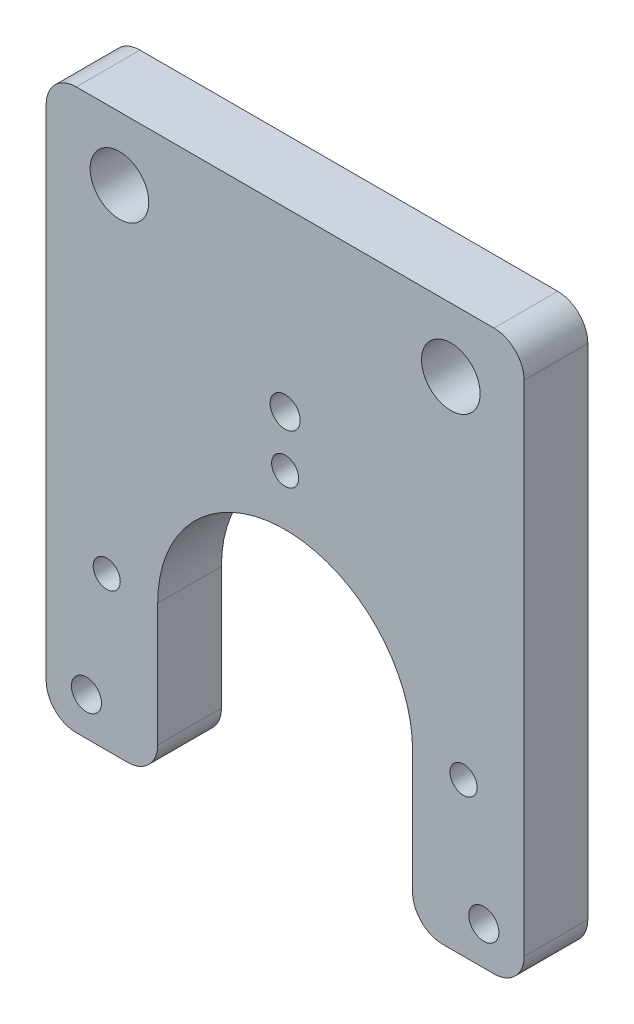
ISO-10303-21;
HEADER;
FILE_DESCRIPTION(('STEP AP214'),'2;1');
FILE_NAME('part.step','',(''),(''),'','','');
FILE_SCHEMA(('AUTOMOTIVE_DESIGN { 1 0 10303 214 1 1 1 1 }'));
ENDSEC;
DATA;
#1=APPLICATION_CONTEXT('core data for automotive mechanical design processes');
#2=APPLICATION_PROTOCOL_DEFINITION('international standard','automotive_design',2000,#1);
#3=PRODUCT_CONTEXT('',#1,'mechanical');
#4=PRODUCT('Part','Part','',(#3));
#5=PRODUCT_RELATED_PRODUCT_CATEGORY('part','',(#4));
#6=PRODUCT_DEFINITION_FORMATION('','',#4);
#7=PRODUCT_DEFINITION_CONTEXT('part definition',#1,'design');
#8=PRODUCT_DEFINITION('design','',#6,#7);
#9=PRODUCT_DEFINITION_SHAPE('','',#8);
#10=(LENGTH_UNIT() NAMED_UNIT(*) SI_UNIT(.MILLI.,.METRE.));
#11=(NAMED_UNIT(*) PLANE_ANGLE_UNIT() SI_UNIT($,.RADIAN.));
#12=(NAMED_UNIT(*) SI_UNIT($,.STERADIAN.) SOLID_ANGLE_UNIT());
#13=UNCERTAINTY_MEASURE_WITH_UNIT(LENGTH_MEASURE(1.E-05),#10,'distance_accuracy_value','');
#14=(GEOMETRIC_REPRESENTATION_CONTEXT(3) GLOBAL_UNCERTAINTY_ASSIGNED_CONTEXT((#13)) GLOBAL_UNIT_ASSIGNED_CONTEXT((#10,
#11,#12)) REPRESENTATION_CONTEXT('',''));
#15=CARTESIAN_POINT('',(0.,0.,0.));
#16=DIRECTION('',(0.,0.,1.));
#17=DIRECTION('',(1.,0.,0.));
#18=AXIS2_PLACEMENT_3D('',#15,#16,#17);
#19=CARTESIAN_POINT('',(23.8125,15.24,6.35));
#20=DIRECTION('',(0.,0.,-1.));
#21=DIRECTION('',(-1.,0.,0.));
#22=AXIS2_PLACEMENT_3D('',#19,#20,#21);
#23=CYLINDRICAL_SURFACE('',#22,12.7);
#24=CARTESIAN_POINT('',(23.8125,15.24,0.));
#25=DIRECTION('',(0.,0.,1.));
#26=DIRECTION('',(1.,0.,0.));
#27=AXIS2_PLACEMENT_3D('',#24,#25,#26);
#28=CIRCLE('',#27,12.7);
#29=CARTESIAN_POINT('',(36.5125,15.24,0.));
#30=VERTEX_POINT('',#29);
#31=CARTESIAN_POINT('',(11.1125,15.24,0.));
#32=VERTEX_POINT('',#31);
#33=EDGE_CURVE('E142',#30,#32,#28,.T.);
#34=ORIENTED_EDGE('',*,*,#33,.F.);
#35=DIRECTION('',(0.,0.,-1.));
#36=VECTOR('',#35,1.);
#37=CARTESIAN_POINT('',(36.5125,15.24,6.35));
#38=LINE('',#37,#36);
#39=CARTESIAN_POINT('',(36.5125,15.24,6.35));
#40=VERTEX_POINT('',#39);
#41=EDGE_CURVE('E137',#40,#30,#38,.T.);
#42=ORIENTED_EDGE('',*,*,#41,.F.);
#43=CARTESIAN_POINT('',(23.8125,15.24,6.35));
#44=DIRECTION('',(0.,0.,1.));
#45=DIRECTION('',(1.,0.,0.));
#46=AXIS2_PLACEMENT_3D('',#43,#44,#45);
#47=CIRCLE('',#46,12.7);
#48=CARTESIAN_POINT('',(11.1125,15.24,6.35));
#49=VERTEX_POINT('',#48);
#50=EDGE_CURVE('E140',#40,#49,#47,.T.);
#51=ORIENTED_EDGE('',*,*,#50,.T.);
#52=DIRECTION('',(0.,0.,-1.));
#53=VECTOR('',#52,1.);
#54=CARTESIAN_POINT('',(11.1125,15.24,6.35));
#55=LINE('',#54,#53);
#56=EDGE_CURVE('E147',#49,#32,#55,.T.);
#57=ORIENTED_EDGE('',*,*,#56,.T.);
#58=EDGE_LOOP('',(#34,#42,#51,#57));
#59=FACE_BOUND('',#58,.T.);
#60=ADVANCED_FACE('F35',(#59),#23,.F.);
#61=CARTESIAN_POINT('',(36.5125,0.,6.35));
#62=DIRECTION('',(1.,0.,0.));
#63=DIRECTION('',(0.,0.,-1.));
#64=AXIS2_PLACEMENT_3D('',#61,#62,#63);
#65=PLANE('',#64);
#66=DIRECTION('',(0.,-1.,0.));
#67=VECTOR('',#66,1.);
#68=CARTESIAN_POINT('',(36.5125,0.,0.));
#69=LINE('',#68,#67);
#70=CARTESIAN_POINT('',(36.5125,3.,0.));
#71=VERTEX_POINT('',#70);
#72=EDGE_CURVE('E207',#30,#71,#69,.T.);
#73=ORIENTED_EDGE('',*,*,#72,.T.);
#74=DIRECTION('',(0.,0.,-1.));
#75=VECTOR('',#74,1.);
#76=CARTESIAN_POINT('',(36.5125,3.,6.35));
#77=LINE('',#76,#75);
#78=CARTESIAN_POINT('',(36.5125,3.,6.35));
#79=VERTEX_POINT('',#78);
#80=EDGE_CURVE('E153',#71,#79,#77,.F.);
#81=ORIENTED_EDGE('',*,*,#80,.T.);
#82=DIRECTION('',(0.,-1.,0.));
#83=VECTOR('',#82,1.);
#84=CARTESIAN_POINT('',(36.5125,0.,6.35));
#85=LINE('',#84,#83);
#86=EDGE_CURVE('E150',#40,#79,#85,.T.);
#87=ORIENTED_EDGE('',*,*,#86,.F.);
#88=ORIENTED_EDGE('',*,*,#41,.T.);
#89=EDGE_LOOP('',(#73,#81,#87,#88));
#90=FACE_BOUND('',#89,.T.);
#91=ADVANCED_FACE('F151',(#90),#65,.F.);
#92=CARTESIAN_POINT('',(0.,0.,6.35));
#93=DIRECTION('',(0.,1.,0.));
#94=DIRECTION('',(0.,0.,1.));
#95=AXIS2_PLACEMENT_3D('',#92,#93,#94);
#96=PLANE('',#95);
#97=DIRECTION('',(1.,0.,0.));
#98=VECTOR('',#97,1.);
#99=CARTESIAN_POINT('',(0.,0.,0.));
#100=LINE('',#99,#98);
#101=CARTESIAN_POINT('',(39.5125,0.,0.));
#102=VERTEX_POINT('',#101);
#103=CARTESIAN_POINT('',(44.625,0.,0.));
#104=VERTEX_POINT('',#103);
#105=EDGE_CURVE('E209',#102,#104,#100,.T.);
#106=ORIENTED_EDGE('',*,*,#105,.T.);
#107=DIRECTION('',(0.,0.,-1.));
#108=VECTOR('',#107,1.);
#109=CARTESIAN_POINT('',(44.625,0.,6.35));
#110=LINE('',#109,#108);
#111=CARTESIAN_POINT('',(44.625,0.,6.35));
#112=VERTEX_POINT('',#111);
#113=EDGE_CURVE('E283',#104,#112,#110,.F.);
#114=ORIENTED_EDGE('',*,*,#113,.T.);
#115=DIRECTION('',(1.,0.,0.));
#116=VECTOR('',#115,1.);
#117=CARTESIAN_POINT('',(0.,0.,6.35));
#118=LINE('',#117,#116);
#119=CARTESIAN_POINT('',(39.5125,0.,6.35));
#120=VERTEX_POINT('',#119);
#121=EDGE_CURVE('E155',#120,#112,#118,.T.);
#122=ORIENTED_EDGE('',*,*,#121,.F.);
#123=DIRECTION('',(0.,0.,-1.));
#124=VECTOR('',#123,1.);
#125=CARTESIAN_POINT('',(39.5125,0.,6.35));
#126=LINE('',#125,#124);
#127=EDGE_CURVE('E280',#120,#102,#126,.T.);
#128=ORIENTED_EDGE('',*,*,#127,.T.);
#129=EDGE_LOOP('',(#106,#114,#122,#128));
#130=FACE_BOUND('',#129,.T.);
#131=ADVANCED_FACE('F311',(#130),#96,.F.);
#132=CARTESIAN_POINT('',(47.625,0.,6.35));
#133=DIRECTION('',(-1.,0.,0.));
#134=DIRECTION('',(0.,0.,1.));
#135=AXIS2_PLACEMENT_3D('',#132,#133,#134);
#136=PLANE('',#135);
#137=DIRECTION('',(0.,1.,0.));
#138=VECTOR('',#137,1.);
#139=CARTESIAN_POINT('',(47.625,0.,0.));
#140=LINE('',#139,#138);
#141=CARTESIAN_POINT('',(47.625,3.,0.));
#142=VERTEX_POINT('',#141);
#143=CARTESIAN_POINT('',(47.625,52.738,0.));
#144=VERTEX_POINT('',#143);
#145=EDGE_CURVE('E212',#142,#144,#140,.T.);
#146=ORIENTED_EDGE('',*,*,#145,.T.);
#147=DIRECTION('',(0.,0.,-1.));
#148=VECTOR('',#147,1.);
#149=CARTESIAN_POINT('',(47.625,52.738,6.35));
#150=LINE('',#149,#148);
#151=CARTESIAN_POINT('',(47.625,52.738,6.35));
#152=VERTEX_POINT('',#151);
#153=EDGE_CURVE('E278',#144,#152,#150,.F.);
#154=ORIENTED_EDGE('',*,*,#153,.T.);
#155=DIRECTION('',(0.,1.,0.));
#156=VECTOR('',#155,1.);
#157=CARTESIAN_POINT('',(47.625,0.,6.35));
#158=LINE('',#157,#156);
#159=CARTESIAN_POINT('',(47.625,3.,6.35));
#160=VERTEX_POINT('',#159);
#161=EDGE_CURVE('E170',#160,#152,#158,.T.);
#162=ORIENTED_EDGE('',*,*,#161,.F.);
#163=DIRECTION('',(0.,0.,-1.));
#164=VECTOR('',#163,1.);
#165=CARTESIAN_POINT('',(47.625,3.,6.35));
#166=LINE('',#165,#164);
#167=EDGE_CURVE('E275',#160,#142,#166,.T.);
#168=ORIENTED_EDGE('',*,*,#167,.T.);
#169=EDGE_LOOP('',(#146,#154,#162,#168));
#170=FACE_BOUND('',#169,.T.);
#171=ADVANCED_FACE('F319',(#170),#136,.F.);
#172=CARTESIAN_POINT('',(0.,55.738,6.35));
#173=DIRECTION('',(0.,1.,0.));
#174=DIRECTION('',(-1.,0.,0.));
#175=AXIS2_PLACEMENT_3D('',#172,#173,#174);
#176=PLANE('',#175);
#177=DIRECTION('',(1.,0.,0.));
#178=VECTOR('',#177,1.);
#179=CARTESIAN_POINT('',(0.,55.738,0.));
#180=LINE('',#179,#178);
#181=CARTESIAN_POINT('',(3.,55.738,0.));
#182=VERTEX_POINT('',#181);
#183=CARTESIAN_POINT('',(44.625,55.738,0.));
#184=VERTEX_POINT('',#183);
#185=EDGE_CURVE('E215',#182,#184,#180,.T.);
#186=ORIENTED_EDGE('',*,*,#185,.F.);
#187=DIRECTION('',(0.,0.,-1.));
#188=VECTOR('',#187,1.);
#189=CARTESIAN_POINT('',(3.,55.738,6.35));
#190=LINE('',#189,#188);
#191=CARTESIAN_POINT('',(3.,55.738,6.35));
#192=VERTEX_POINT('',#191);
#193=EDGE_CURVE('E262',#182,#192,#190,.F.);
#194=ORIENTED_EDGE('',*,*,#193,.T.);
#195=DIRECTION('',(1.,0.,0.));
#196=VECTOR('',#195,1.);
#197=CARTESIAN_POINT('',(0.,55.738,6.35));
#198=LINE('',#197,#196);
#199=CARTESIAN_POINT('',(44.625,55.738,6.35));
#200=VERTEX_POINT('',#199);
#201=EDGE_CURVE('E173',#192,#200,#198,.T.);
#202=ORIENTED_EDGE('',*,*,#201,.T.);
#203=DIRECTION('',(0.,0.,-1.));
#204=VECTOR('',#203,1.);
#205=CARTESIAN_POINT('',(44.625,55.738,0.));
#206=LINE('',#205,#204);
#207=EDGE_CURVE('E259',#200,#184,#206,.T.);
#208=ORIENTED_EDGE('',*,*,#207,.T.);
#209=EDGE_LOOP('',(#186,#194,#202,#208));
#210=FACE_BOUND('',#209,.T.);
#211=ADVANCED_FACE('F328',(#210),#176,.T.);
#212=CARTESIAN_POINT('',(0.,0.,6.35));
#213=DIRECTION('',(-1.,0.,0.));
#214=DIRECTION('',(0.,0.,1.));
#215=AXIS2_PLACEMENT_3D('',#212,#213,#214);
#216=PLANE('',#215);
#217=DIRECTION('',(0.,1.,0.));
#218=VECTOR('',#217,1.);
#219=CARTESIAN_POINT('',(0.,0.,6.35));
#220=LINE('',#219,#218);
#221=CARTESIAN_POINT('',(0.,3.,6.35));
#222=VERTEX_POINT('',#221);
#223=CARTESIAN_POINT('',(0.,52.738,6.35));
#224=VERTEX_POINT('',#223);
#225=EDGE_CURVE('E176',#222,#224,#220,.T.);
#226=ORIENTED_EDGE('',*,*,#225,.T.);
#227=DIRECTION('',(0.,0.,-1.));
#228=VECTOR('',#227,1.);
#229=CARTESIAN_POINT('',(0.,52.738,6.35));
#230=LINE('',#229,#228);
#231=CARTESIAN_POINT('',(0.,52.738,0.));
#232=VERTEX_POINT('',#231);
#233=EDGE_CURVE('E244',#224,#232,#230,.T.);
#234=ORIENTED_EDGE('',*,*,#233,.T.);
#235=DIRECTION('',(0.,1.,0.));
#236=VECTOR('',#235,1.);
#237=CARTESIAN_POINT('',(0.,0.,0.));
#238=LINE('',#237,#236);
#239=CARTESIAN_POINT('',(0.,3.,0.));
#240=VERTEX_POINT('',#239);
#241=EDGE_CURVE('E218',#240,#232,#238,.T.);
#242=ORIENTED_EDGE('',*,*,#241,.F.);
#243=DIRECTION('',(0.,0.,-1.));
#244=VECTOR('',#243,1.);
#245=CARTESIAN_POINT('',(0.,3.,6.35));
#246=LINE('',#245,#244);
#247=EDGE_CURVE('E146',#240,#222,#246,.F.);
#248=ORIENTED_EDGE('',*,*,#247,.T.);
#249=EDGE_LOOP('',(#226,#234,#242,#248));
#250=FACE_BOUND('',#249,.T.);
#251=ADVANCED_FACE('F335',(#250),#216,.T.);
#252=CARTESIAN_POINT('',(0.,0.,6.35));
#253=DIRECTION('',(0.,1.,0.));
#254=DIRECTION('',(0.,0.,1.));
#255=AXIS2_PLACEMENT_3D('',#252,#253,#254);
#256=PLANE('',#255);
#257=DIRECTION('',(1.,0.,0.));
#258=VECTOR('',#257,1.);
#259=CARTESIAN_POINT('',(0.,0.,0.));
#260=LINE('',#259,#258);
#261=CARTESIAN_POINT('',(3.,0.,0.));
#262=VERTEX_POINT('',#261);
#263=CARTESIAN_POINT('',(8.1125,0.,0.));
#264=VERTEX_POINT('',#263);
#265=EDGE_CURVE('E221',#262,#264,#260,.T.);
#266=ORIENTED_EDGE('',*,*,#265,.T.);
#267=DIRECTION('',(0.,0.,-1.));
#268=VECTOR('',#267,1.);
#269=CARTESIAN_POINT('',(8.1125,0.,6.35));
#270=LINE('',#269,#268);
#271=CARTESIAN_POINT('',(8.1125,0.,6.35));
#272=VERTEX_POINT('',#271);
#273=EDGE_CURVE('E11',#264,#272,#270,.F.);
#274=ORIENTED_EDGE('',*,*,#273,.T.);
#275=DIRECTION('',(1.,0.,0.));
#276=VECTOR('',#275,1.);
#277=CARTESIAN_POINT('',(0.,0.,6.35));
#278=LINE('',#277,#276);
#279=CARTESIAN_POINT('',(3.,0.,6.35));
#280=VERTEX_POINT('',#279);
#281=EDGE_CURVE('E179',#280,#272,#278,.T.);
#282=ORIENTED_EDGE('',*,*,#281,.F.);
#283=DIRECTION('',(0.,0.,-1.));
#284=VECTOR('',#283,1.);
#285=CARTESIAN_POINT('',(3.,0.,0.));
#286=LINE('',#285,#284);
#287=EDGE_CURVE('E43',#280,#262,#286,.T.);
#288=ORIENTED_EDGE('',*,*,#287,.T.);
#289=EDGE_LOOP('',(#266,#274,#282,#288));
#290=FACE_BOUND('',#289,.T.);
#291=ADVANCED_FACE('F291',(#290),#256,.F.);
#292=CARTESIAN_POINT('',(7.3025,49.388,6.35));
#293=DIRECTION('',(0.,0.,-1.));
#294=DIRECTION('',(-1.,0.,0.));
#295=AXIS2_PLACEMENT_3D('',#292,#293,#294);
#296=CYLINDRICAL_SURFACE('',#295,2.921);
#297=CARTESIAN_POINT('',(7.3025,49.388,6.35));
#298=DIRECTION('',(0.,0.,1.));
#299=DIRECTION('',(1.,0.,0.));
#300=AXIS2_PLACEMENT_3D('',#297,#298,#299);
#301=CIRCLE('',#300,2.921);
#302=CARTESIAN_POINT('',(10.2235,49.388,6.35));
#303=VERTEX_POINT('',#302);
#304=EDGE_CURVE('E191',#303,#303,#301,.T.);
#305=ORIENTED_EDGE('',*,*,#304,.T.);
#306=EDGE_LOOP('',(#305));
#307=FACE_BOUND('',#306,.T.);
#308=CARTESIAN_POINT('',(7.3025,49.388,0.));
#309=DIRECTION('',(0.,0.,1.));
#310=DIRECTION('',(1.,0.,0.));
#311=AXIS2_PLACEMENT_3D('',#308,#309,#310);
#312=CIRCLE('',#311,2.921);
#313=CARTESIAN_POINT('',(10.2235,49.388,0.));
#314=VERTEX_POINT('',#313);
#315=EDGE_CURVE('E235',#314,#314,#312,.T.);
#316=ORIENTED_EDGE('',*,*,#315,.F.);
#317=EDGE_LOOP('',(#316));
#318=FACE_BOUND('',#317,.T.);
#319=ADVANCED_FACE('F474',(#307,#318),#296,.F.);
#320=CARTESIAN_POINT('',(6.0325,15.24,6.35));
#321=DIRECTION('',(0.,0.,-1.));
#322=DIRECTION('',(-1.,0.,0.));
#323=AXIS2_PLACEMENT_3D('',#320,#321,#322);
#324=CYLINDRICAL_SURFACE('',#323,1.35);
#325=CARTESIAN_POINT('',(6.0325,15.24,6.35));
#326=DIRECTION('',(0.,0.,1.));
#327=DIRECTION('',(1.,0.,0.));
#328=AXIS2_PLACEMENT_3D('',#325,#326,#327);
#329=CIRCLE('',#328,1.35);
#330=CARTESIAN_POINT('',(7.3825,15.24,6.35));
#331=VERTEX_POINT('',#330);
#332=EDGE_CURVE('E188',#331,#331,#329,.T.);
#333=ORIENTED_EDGE('',*,*,#332,.T.);
#334=EDGE_LOOP('',(#333));
#335=FACE_BOUND('',#334,.T.);
#336=CARTESIAN_POINT('',(6.0325,15.24,0.));
#337=DIRECTION('',(0.,0.,1.));
#338=DIRECTION('',(1.,0.,0.));
#339=AXIS2_PLACEMENT_3D('',#336,#337,#338);
#340=CIRCLE('',#339,1.35);
#341=CARTESIAN_POINT('',(7.3825,15.24,0.));
#342=VERTEX_POINT('',#341);
#343=EDGE_CURVE('E232',#342,#342,#340,.T.);
#344=ORIENTED_EDGE('',*,*,#343,.F.);
#345=EDGE_LOOP('',(#344));
#346=FACE_BOUND('',#345,.T.);
#347=ADVANCED_FACE('F465',(#335,#346),#324,.F.);
#348=CARTESIAN_POINT('',(23.8125,33.02,6.35));
#349=DIRECTION('',(0.,0.,-1.));
#350=DIRECTION('',(-1.,0.,0.));
#351=AXIS2_PLACEMENT_3D('',#348,#349,#350);
#352=CYLINDRICAL_SURFACE('',#351,1.35);
#353=CARTESIAN_POINT('',(23.8125,33.02,6.35));
#354=DIRECTION('',(0.,0.,1.));
#355=DIRECTION('',(1.,0.,0.));
#356=AXIS2_PLACEMENT_3D('',#353,#354,#355);
#357=CIRCLE('',#356,1.35);
#358=CARTESIAN_POINT('',(25.1625,33.02,6.35));
#359=VERTEX_POINT('',#358);
#360=EDGE_CURVE('E185',#359,#359,#357,.T.);
#361=ORIENTED_EDGE('',*,*,#360,.T.);
#362=EDGE_LOOP('',(#361));
#363=FACE_BOUND('',#362,.T.);
#364=CARTESIAN_POINT('',(23.8125,33.02,0.));
#365=DIRECTION('',(0.,0.,1.));
#366=DIRECTION('',(1.,0.,0.));
#367=AXIS2_PLACEMENT_3D('',#364,#365,#366);
#368=CIRCLE('',#367,1.35);
#369=CARTESIAN_POINT('',(25.1625,33.02,0.));
#370=VERTEX_POINT('',#369);
#371=EDGE_CURVE('E229',#370,#370,#368,.T.);
#372=ORIENTED_EDGE('',*,*,#371,.F.);
#373=EDGE_LOOP('',(#372));
#374=FACE_BOUND('',#373,.T.);
#375=ADVANCED_FACE('F456',(#363,#374),#352,.F.);
#376=CARTESIAN_POINT('',(41.5925,15.24,6.35));
#377=DIRECTION('',(0.,0.,-1.));
#378=DIRECTION('',(-1.,0.,0.));
#379=AXIS2_PLACEMENT_3D('',#376,#377,#378);
#380=CYLINDRICAL_SURFACE('',#379,1.35);
#381=CARTESIAN_POINT('',(41.5925,15.24,6.35));
#382=DIRECTION('',(0.,0.,1.));
#383=DIRECTION('',(1.,0.,0.));
#384=AXIS2_PLACEMENT_3D('',#381,#382,#383);
#385=CIRCLE('',#384,1.35);
#386=CARTESIAN_POINT('',(42.9425,15.24,6.35));
#387=VERTEX_POINT('',#386);
#388=EDGE_CURVE('E182',#387,#387,#385,.T.);
#389=ORIENTED_EDGE('',*,*,#388,.T.);
#390=EDGE_LOOP('',(#389));
#391=FACE_BOUND('',#390,.T.);
#392=CARTESIAN_POINT('',(41.5925,15.24,0.));
#393=DIRECTION('',(0.,0.,1.));
#394=DIRECTION('',(1.,0.,0.));
#395=AXIS2_PLACEMENT_3D('',#392,#393,#394);
#396=CIRCLE('',#395,1.35);
#397=CARTESIAN_POINT('',(42.9425,15.24,0.));
#398=VERTEX_POINT('',#397);
#399=EDGE_CURVE('E226',#398,#398,#396,.T.);
#400=ORIENTED_EDGE('',*,*,#399,.F.);
#401=EDGE_LOOP('',(#400));
#402=FACE_BOUND('',#401,.T.);
#403=ADVANCED_FACE('F448',(#391,#402),#380,.F.);
#404=CARTESIAN_POINT('',(11.1125,0.,6.35));
#405=DIRECTION('',(1.,0.,0.));
#406=DIRECTION('',(0.,1.,0.));
#407=AXIS2_PLACEMENT_3D('',#404,#405,#406);
#408=PLANE('',#407);
#409=DIRECTION('',(0.,-1.,0.));
#410=VECTOR('',#409,1.);
#411=CARTESIAN_POINT('',(11.1125,0.,6.35));
#412=LINE('',#411,#410);
#413=CARTESIAN_POINT('',(11.1125,3.,6.35));
#414=VERTEX_POINT('',#413);
#415=EDGE_CURVE('E160',#49,#414,#412,.T.);
#416=ORIENTED_EDGE('',*,*,#415,.T.);
#417=DIRECTION('',(0.,0.,-1.));
#418=VECTOR('',#417,1.);
#419=CARTESIAN_POINT('',(11.1125,3.,0.));
#420=LINE('',#419,#418);
#421=CARTESIAN_POINT('',(11.1125,3.,0.));
#422=VERTEX_POINT('',#421);
#423=EDGE_CURVE('E286',#414,#422,#420,.T.);
#424=ORIENTED_EDGE('',*,*,#423,.T.);
#425=DIRECTION('',(0.,-1.,0.));
#426=VECTOR('',#425,1.);
#427=CARTESIAN_POINT('',(11.1125,0.,0.));
#428=LINE('',#427,#426);
#429=EDGE_CURVE('E223',#32,#422,#428,.T.);
#430=ORIENTED_EDGE('',*,*,#429,.F.);
#431=ORIENTED_EDGE('',*,*,#56,.F.);
#432=EDGE_LOOP('',(#416,#424,#430,#431));
#433=FACE_BOUND('',#432,.T.);
#434=ADVANCED_FACE('F303',(#433),#408,.T.);
#435=CARTESIAN_POINT('',(23.8125,38.1,6.35));
#436=DIRECTION('',(0.,0.,-1.));
#437=DIRECTION('',(-1.,0.,0.));
#438=AXIS2_PLACEMENT_3D('',#435,#436,#437);
#439=CYLINDRICAL_SURFACE('',#438,1.5);
#440=CARTESIAN_POINT('',(23.8125,38.1,6.35));
#441=DIRECTION('',(0.,0.,1.));
#442=DIRECTION('',(1.,0.,0.));
#443=AXIS2_PLACEMENT_3D('',#440,#441,#442);
#444=CIRCLE('',#443,1.5);
#445=CARTESIAN_POINT('',(25.3125,38.1,6.35));
#446=VERTEX_POINT('',#445);
#447=EDGE_CURVE('E161',#446,#446,#444,.T.);
#448=ORIENTED_EDGE('',*,*,#447,.T.);
#449=EDGE_LOOP('',(#448));
#450=FACE_BOUND('',#449,.T.);
#451=CARTESIAN_POINT('',(23.8125,38.1,0.));
#452=DIRECTION('',(0.,0.,1.));
#453=DIRECTION('',(1.,0.,0.));
#454=AXIS2_PLACEMENT_3D('',#451,#452,#453);
#455=CIRCLE('',#454,1.5);
#456=CARTESIAN_POINT('',(25.3125,38.1,0.));
#457=VERTEX_POINT('',#456);
#458=EDGE_CURVE('E203',#457,#457,#455,.T.);
#459=ORIENTED_EDGE('',*,*,#458,.F.);
#460=EDGE_LOOP('',(#459));
#461=FACE_BOUND('',#460,.T.);
#462=ADVANCED_FACE('F349',(#450,#461),#439,.F.);
#463=CARTESIAN_POINT('',(43.6098407305123,3.81,6.35));
#464=DIRECTION('',(0.,0.,-1.));
#465=DIRECTION('',(-1.,0.,0.));
#466=AXIS2_PLACEMENT_3D('',#463,#464,#465);
#467=CYLINDRICAL_SURFACE('',#466,1.5);
#468=CARTESIAN_POINT('',(43.6098407305123,3.81,6.35));
#469=DIRECTION('',(0.,0.,1.));
#470=DIRECTION('',(1.,0.,0.));
#471=AXIS2_PLACEMENT_3D('',#468,#469,#470);
#472=CIRCLE('',#471,1.5);
#473=CARTESIAN_POINT('',(45.1098407305123,3.81,6.35));
#474=VERTEX_POINT('',#473);
#475=EDGE_CURVE('E164',#474,#474,#472,.T.);
#476=ORIENTED_EDGE('',*,*,#475,.T.);
#477=EDGE_LOOP('',(#476));
#478=FACE_BOUND('',#477,.T.);
#479=CARTESIAN_POINT('',(43.6098407305123,3.81,0.));
#480=DIRECTION('',(0.,0.,1.));
#481=DIRECTION('',(1.,0.,0.));
#482=AXIS2_PLACEMENT_3D('',#479,#480,#481);
#483=CIRCLE('',#482,1.5);
#484=CARTESIAN_POINT('',(45.1098407305123,3.81,0.));
#485=VERTEX_POINT('',#484);
#486=EDGE_CURVE('E200',#485,#485,#483,.T.);
#487=ORIENTED_EDGE('',*,*,#486,.F.);
#488=EDGE_LOOP('',(#487));
#489=FACE_BOUND('',#488,.T.);
#490=ADVANCED_FACE('F352',(#478,#489),#467,.F.);
#491=CARTESIAN_POINT('',(4.01515926948773,3.80999999999999,6.35));
#492=DIRECTION('',(0.,0.,-1.));
#493=DIRECTION('',(-1.,0.,0.));
#494=AXIS2_PLACEMENT_3D('',#491,#492,#493);
#495=CYLINDRICAL_SURFACE('',#494,1.5);
#496=CARTESIAN_POINT('',(4.01515926948773,3.80999999999999,6.35));
#497=DIRECTION('',(0.,0.,1.));
#498=DIRECTION('',(1.,0.,0.));
#499=AXIS2_PLACEMENT_3D('',#496,#497,#498);
#500=CIRCLE('',#499,1.5);
#501=CARTESIAN_POINT('',(5.51515926948774,3.80999999999999,6.35));
#502=VERTEX_POINT('',#501);
#503=EDGE_CURVE('E241',#502,#502,#500,.T.);
#504=ORIENTED_EDGE('',*,*,#503,.T.);
#505=EDGE_LOOP('',(#504));
#506=FACE_BOUND('',#505,.T.);
#507=CARTESIAN_POINT('',(4.01515926948773,3.80999999999999,0.));
#508=DIRECTION('',(0.,0.,1.));
#509=DIRECTION('',(1.,0.,0.));
#510=AXIS2_PLACEMENT_3D('',#507,#508,#509);
#511=CIRCLE('',#510,1.5);
#512=CARTESIAN_POINT('',(5.51515926948774,3.80999999999999,0.));
#513=VERTEX_POINT('',#512);
#514=EDGE_CURVE('E197',#513,#513,#511,.T.);
#515=ORIENTED_EDGE('',*,*,#514,.F.);
#516=EDGE_LOOP('',(#515));
#517=FACE_BOUND('',#516,.T.);
#518=ADVANCED_FACE('F356',(#506,#517),#495,.F.);
#519=CARTESIAN_POINT('',(40.3225,49.388,6.35));
#520=DIRECTION('',(0.,0.,-1.));
#521=DIRECTION('',(-1.,0.,0.));
#522=AXIS2_PLACEMENT_3D('',#519,#520,#521);
#523=CYLINDRICAL_SURFACE('',#522,2.92100000000001);
#524=CARTESIAN_POINT('',(40.3225,49.388,6.35));
#525=DIRECTION('',(0.,0.,1.));
#526=DIRECTION('',(1.,0.,0.));
#527=AXIS2_PLACEMENT_3D('',#524,#525,#526);
#528=CIRCLE('',#527,2.92100000000001);
#529=CARTESIAN_POINT('',(43.2435,49.388,6.35));
#530=VERTEX_POINT('',#529);
#531=EDGE_CURVE('E194',#530,#530,#528,.F.);
#532=ORIENTED_EDGE('',*,*,#531,.F.);
#533=EDGE_LOOP('',(#532));
#534=FACE_BOUND('',#533,.T.);
#535=CARTESIAN_POINT('',(40.3225,49.388,0.));
#536=DIRECTION('',(0.,0.,1.));
#537=DIRECTION('',(1.,0.,0.));
#538=AXIS2_PLACEMENT_3D('',#535,#536,#537);
#539=CIRCLE('',#538,2.92100000000001);
#540=CARTESIAN_POINT('',(43.2435,49.388,0.));
#541=VERTEX_POINT('',#540);
#542=EDGE_CURVE('E238',#541,#541,#539,.F.);
#543=ORIENTED_EDGE('',*,*,#542,.T.);
#544=EDGE_LOOP('',(#543));
#545=FACE_BOUND('',#544,.T.);
#546=ADVANCED_FACE('F360',(#534,#545),#523,.F.);
#547=CARTESIAN_POINT('',(0.,0.,6.35));
#548=DIRECTION('',(0.,0.,1.));
#549=DIRECTION('',(1.,0.,0.));
#550=AXIS2_PLACEMENT_3D('',#547,#548,#549);
#551=PLANE('',#550);
#552=ORIENTED_EDGE('',*,*,#503,.F.);
#553=EDGE_LOOP('',(#552));
#554=FACE_BOUND('',#553,.T.);
#555=ORIENTED_EDGE('',*,*,#475,.F.);
#556=EDGE_LOOP('',(#555));
#557=FACE_BOUND('',#556,.T.);
#558=ORIENTED_EDGE('',*,*,#447,.F.);
#559=EDGE_LOOP('',(#558));
#560=FACE_BOUND('',#559,.T.);
#561=ORIENTED_EDGE('',*,*,#201,.F.);
#562=CARTESIAN_POINT('',(3.,52.738,6.35));
#563=DIRECTION('',(0.,0.,1.));
#564=DIRECTION('',(1.,0.,0.));
#565=AXIS2_PLACEMENT_3D('',#562,#563,#564);
#566=CIRCLE('',#565,3.);
#567=EDGE_CURVE('E273',#192,#224,#566,.T.);
#568=ORIENTED_EDGE('',*,*,#567,.T.);
#569=ORIENTED_EDGE('',*,*,#225,.F.);
#570=CARTESIAN_POINT('',(3.,3.,6.35));
#571=DIRECTION('',(0.,0.,1.));
#572=DIRECTION('',(1.,0.,0.));
#573=AXIS2_PLACEMENT_3D('',#570,#571,#572);
#574=CIRCLE('',#573,3.);
#575=EDGE_CURVE('E264',#222,#280,#574,.T.);
#576=ORIENTED_EDGE('',*,*,#575,.T.);
#577=ORIENTED_EDGE('',*,*,#281,.T.);
#578=CARTESIAN_POINT('',(8.1125,3.,6.35));
#579=DIRECTION('',(0.,0.,1.));
#580=DIRECTION('',(1.,0.,0.));
#581=AXIS2_PLACEMENT_3D('',#578,#579,#580);
#582=CIRCLE('',#581,3.);
#583=EDGE_CURVE('E50',#272,#414,#582,.T.);
#584=ORIENTED_EDGE('',*,*,#583,.T.);
#585=ORIENTED_EDGE('',*,*,#415,.F.);
#586=ORIENTED_EDGE('',*,*,#50,.F.);
#587=ORIENTED_EDGE('',*,*,#86,.T.);
#588=CARTESIAN_POINT('',(39.5125,3.,6.35));
#589=DIRECTION('',(0.,0.,1.));
#590=DIRECTION('',(1.,0.,0.));
#591=AXIS2_PLACEMENT_3D('',#588,#589,#590);
#592=CIRCLE('',#591,3.);
#593=EDGE_CURVE('E267',#79,#120,#592,.T.);
#594=ORIENTED_EDGE('',*,*,#593,.T.);
#595=ORIENTED_EDGE('',*,*,#121,.T.);
#596=CARTESIAN_POINT('',(44.625,3.,6.35));
#597=DIRECTION('',(0.,0.,1.));
#598=DIRECTION('',(1.,0.,0.));
#599=AXIS2_PLACEMENT_3D('',#596,#597,#598);
#600=CIRCLE('',#599,3.);
#601=EDGE_CURVE('E269',#112,#160,#600,.T.);
#602=ORIENTED_EDGE('',*,*,#601,.T.);
#603=ORIENTED_EDGE('',*,*,#161,.T.);
#604=CARTESIAN_POINT('',(44.625,52.738,6.35));
#605=DIRECTION('',(0.,0.,1.));
#606=DIRECTION('',(1.,0.,0.));
#607=AXIS2_PLACEMENT_3D('',#604,#605,#606);
#608=CIRCLE('',#607,3.);
#609=EDGE_CURVE('E271',#152,#200,#608,.T.);
#610=ORIENTED_EDGE('',*,*,#609,.T.);
#611=EDGE_LOOP('',(#561,#568,#569,#576,#577,#584,#585,#586,#587,#594,#595,#602,#603,#610));
#612=FACE_BOUND('',#611,.T.);
#613=ORIENTED_EDGE('',*,*,#388,.F.);
#614=EDGE_LOOP('',(#613));
#615=FACE_BOUND('',#614,.T.);
#616=ORIENTED_EDGE('',*,*,#360,.F.);
#617=EDGE_LOOP('',(#616));
#618=FACE_BOUND('',#617,.T.);
#619=ORIENTED_EDGE('',*,*,#332,.F.);
#620=EDGE_LOOP('',(#619));
#621=FACE_BOUND('',#620,.T.);
#622=ORIENTED_EDGE('',*,*,#304,.F.);
#623=EDGE_LOOP('',(#622));
#624=FACE_BOUND('',#623,.T.);
#625=ORIENTED_EDGE('',*,*,#531,.T.);
#626=EDGE_LOOP('',(#625));
#627=FACE_BOUND('',#626,.T.);
#628=ADVANCED_FACE('F158',(#554,#557,#560,#612,#615,#618,#621,#624,#627),#551,.T.);
#629=CARTESIAN_POINT('',(0.,0.,0.));
#630=DIRECTION('',(0.,0.,1.));
#631=DIRECTION('',(1.,0.,0.));
#632=AXIS2_PLACEMENT_3D('',#629,#630,#631);
#633=PLANE('',#632);
#634=ORIENTED_EDGE('',*,*,#514,.T.);
#635=EDGE_LOOP('',(#634));
#636=FACE_BOUND('',#635,.T.);
#637=ORIENTED_EDGE('',*,*,#486,.T.);
#638=EDGE_LOOP('',(#637));
#639=FACE_BOUND('',#638,.T.);
#640=ORIENTED_EDGE('',*,*,#458,.T.);
#641=EDGE_LOOP('',(#640));
#642=FACE_BOUND('',#641,.T.);
#643=ORIENTED_EDGE('',*,*,#241,.T.);
#644=CARTESIAN_POINT('',(3.,52.738,0.));
#645=DIRECTION('',(0.,0.,1.));
#646=DIRECTION('',(1.,0.,0.));
#647=AXIS2_PLACEMENT_3D('',#644,#645,#646);
#648=CIRCLE('',#647,3.);
#649=EDGE_CURVE('E257',#232,#182,#648,.F.);
#650=ORIENTED_EDGE('',*,*,#649,.T.);
#651=ORIENTED_EDGE('',*,*,#185,.T.);
#652=CARTESIAN_POINT('',(44.625,52.738,0.));
#653=DIRECTION('',(0.,0.,1.));
#654=DIRECTION('',(1.,0.,0.));
#655=AXIS2_PLACEMENT_3D('',#652,#653,#654);
#656=CIRCLE('',#655,3.);
#657=EDGE_CURVE('E255',#184,#144,#656,.F.);
#658=ORIENTED_EDGE('',*,*,#657,.T.);
#659=ORIENTED_EDGE('',*,*,#145,.F.);
#660=CARTESIAN_POINT('',(44.625,3.,0.));
#661=DIRECTION('',(0.,0.,1.));
#662=DIRECTION('',(1.,0.,0.));
#663=AXIS2_PLACEMENT_3D('',#660,#661,#662);
#664=CIRCLE('',#663,3.);
#665=EDGE_CURVE('E253',#142,#104,#664,.F.);
#666=ORIENTED_EDGE('',*,*,#665,.T.);
#667=ORIENTED_EDGE('',*,*,#105,.F.);
#668=CARTESIAN_POINT('',(39.5125,3.,0.));
#669=DIRECTION('',(0.,0.,1.));
#670=DIRECTION('',(1.,0.,0.));
#671=AXIS2_PLACEMENT_3D('',#668,#669,#670);
#672=CIRCLE('',#671,3.);
#673=EDGE_CURVE('E251',#102,#71,#672,.F.);
#674=ORIENTED_EDGE('',*,*,#673,.T.);
#675=ORIENTED_EDGE('',*,*,#72,.F.);
#676=ORIENTED_EDGE('',*,*,#33,.T.);
#677=ORIENTED_EDGE('',*,*,#429,.T.);
#678=CARTESIAN_POINT('',(8.1125,3.,0.));
#679=DIRECTION('',(0.,0.,1.));
#680=DIRECTION('',(1.,0.,0.));
#681=AXIS2_PLACEMENT_3D('',#678,#679,#680);
#682=CIRCLE('',#681,3.);
#683=EDGE_CURVE('E249',#422,#264,#682,.F.);
#684=ORIENTED_EDGE('',*,*,#683,.T.);
#685=ORIENTED_EDGE('',*,*,#265,.F.);
#686=CARTESIAN_POINT('',(3.,3.,0.));
#687=DIRECTION('',(0.,0.,1.));
#688=DIRECTION('',(1.,0.,0.));
#689=AXIS2_PLACEMENT_3D('',#686,#687,#688);
#690=CIRCLE('',#689,3.);
#691=EDGE_CURVE('E247',#262,#240,#690,.F.);
#692=ORIENTED_EDGE('',*,*,#691,.T.);
#693=EDGE_LOOP('',(#643,#650,#651,#658,#659,#666,#667,#674,#675,#676,#677,#684,#685,#692));
#694=FACE_BOUND('',#693,.T.);
#695=ORIENTED_EDGE('',*,*,#399,.T.);
#696=EDGE_LOOP('',(#695));
#697=FACE_BOUND('',#696,.T.);
#698=ORIENTED_EDGE('',*,*,#371,.T.);
#699=EDGE_LOOP('',(#698));
#700=FACE_BOUND('',#699,.T.);
#701=ORIENTED_EDGE('',*,*,#343,.T.);
#702=EDGE_LOOP('',(#701));
#703=FACE_BOUND('',#702,.T.);
#704=ORIENTED_EDGE('',*,*,#315,.T.);
#705=EDGE_LOOP('',(#704));
#706=FACE_BOUND('',#705,.T.);
#707=ORIENTED_EDGE('',*,*,#542,.F.);
#708=EDGE_LOOP('',(#707));
#709=FACE_BOUND('',#708,.T.);
#710=ADVANCED_FACE('F295',(#636,#639,#642,#694,#697,#700,#703,#706,#709),#633,.F.);
#711=CARTESIAN_POINT('',(3.,52.738,6.35));
#712=DIRECTION('',(0.,0.,-1.));
#713=DIRECTION('',(-1.,0.,0.));
#714=AXIS2_PLACEMENT_3D('',#711,#712,#713);
#715=CYLINDRICAL_SURFACE('',#714,3.);
#716=ORIENTED_EDGE('',*,*,#567,.F.);
#717=ORIENTED_EDGE('',*,*,#193,.F.);
#718=ORIENTED_EDGE('',*,*,#649,.F.);
#719=ORIENTED_EDGE('',*,*,#233,.F.);
#720=EDGE_LOOP('',(#716,#717,#718,#719));
#721=FACE_BOUND('',#720,.T.);
#722=ADVANCED_FACE('F331',(#721),#715,.T.);
#723=CARTESIAN_POINT('',(44.625,52.738,6.35));
#724=DIRECTION('',(0.,0.,1.));
#725=DIRECTION('',(1.,0.,0.));
#726=AXIS2_PLACEMENT_3D('',#723,#724,#725);
#727=CYLINDRICAL_SURFACE('',#726,3.);
#728=ORIENTED_EDGE('',*,*,#609,.F.);
#729=ORIENTED_EDGE('',*,*,#153,.F.);
#730=ORIENTED_EDGE('',*,*,#657,.F.);
#731=ORIENTED_EDGE('',*,*,#207,.F.);
#732=EDGE_LOOP('',(#728,#729,#730,#731));
#733=FACE_BOUND('',#732,.T.);
#734=ADVANCED_FACE('F323',(#733),#727,.T.);
#735=CARTESIAN_POINT('',(44.625,3.,6.35));
#736=DIRECTION('',(0.,0.,-1.));
#737=DIRECTION('',(-1.,0.,0.));
#738=AXIS2_PLACEMENT_3D('',#735,#736,#737);
#739=CYLINDRICAL_SURFACE('',#738,3.);
#740=ORIENTED_EDGE('',*,*,#601,.F.);
#741=ORIENTED_EDGE('',*,*,#113,.F.);
#742=ORIENTED_EDGE('',*,*,#665,.F.);
#743=ORIENTED_EDGE('',*,*,#167,.F.);
#744=EDGE_LOOP('',(#740,#741,#742,#743));
#745=FACE_BOUND('',#744,.T.);
#746=ADVANCED_FACE('F314',(#745),#739,.T.);
#747=CARTESIAN_POINT('',(39.5125,3.,6.35));
#748=DIRECTION('',(0.,0.,-1.));
#749=DIRECTION('',(-1.,0.,0.));
#750=AXIS2_PLACEMENT_3D('',#747,#748,#749);
#751=CYLINDRICAL_SURFACE('',#750,3.);
#752=ORIENTED_EDGE('',*,*,#593,.F.);
#753=ORIENTED_EDGE('',*,*,#80,.F.);
#754=ORIENTED_EDGE('',*,*,#673,.F.);
#755=ORIENTED_EDGE('',*,*,#127,.F.);
#756=EDGE_LOOP('',(#752,#753,#754,#755));
#757=FACE_BOUND('',#756,.T.);
#758=ADVANCED_FACE('F306',(#757),#751,.T.);
#759=CARTESIAN_POINT('',(8.1125,3.,6.35));
#760=DIRECTION('',(0.,0.,1.));
#761=DIRECTION('',(1.,0.,0.));
#762=AXIS2_PLACEMENT_3D('',#759,#760,#761);
#763=CYLINDRICAL_SURFACE('',#762,3.);
#764=ORIENTED_EDGE('',*,*,#583,.F.);
#765=ORIENTED_EDGE('',*,*,#273,.F.);
#766=ORIENTED_EDGE('',*,*,#683,.F.);
#767=ORIENTED_EDGE('',*,*,#423,.F.);
#768=EDGE_LOOP('',(#764,#765,#766,#767));
#769=FACE_BOUND('',#768,.T.);
#770=ADVANCED_FACE('F301',(#769),#763,.T.);
#771=CARTESIAN_POINT('',(3.,3.,6.35));
#772=DIRECTION('',(0.,0.,1.));
#773=DIRECTION('',(1.,0.,0.));
#774=AXIS2_PLACEMENT_3D('',#771,#772,#773);
#775=CYLINDRICAL_SURFACE('',#774,3.);
#776=ORIENTED_EDGE('',*,*,#575,.F.);
#777=ORIENTED_EDGE('',*,*,#247,.F.);
#778=ORIENTED_EDGE('',*,*,#691,.F.);
#779=ORIENTED_EDGE('',*,*,#287,.F.);
#780=EDGE_LOOP('',(#776,#777,#778,#779));
#781=FACE_BOUND('',#780,.T.);
#782=ADVANCED_FACE('F37',(#781),#775,.T.);
#783=CLOSED_SHELL('',(#60,#91,#131,#171,#211,#251,#291,#319,#347,#375,#403,#434,#462,#490,#518,
#546,#628,#710,#722,#734,#746,#758,#770,#782));
#784=MANIFOLD_SOLID_BREP('B2',#783);
#785=ADVANCED_BREP_SHAPE_REPRESENTATION('',(#18,#784),#14);
#786=SHAPE_DEFINITION_REPRESENTATION(#9,#785);
ENDSEC;
END-ISO-10303-21;
